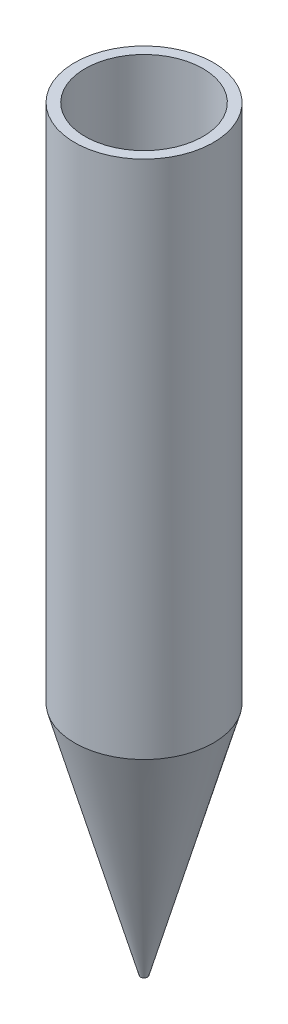
ISO-10303-21;
HEADER;
FILE_DESCRIPTION(('STEP AP214'),'2;1');
FILE_NAME('part.step','',(''),(''),'','','');
FILE_SCHEMA(('AUTOMOTIVE_DESIGN { 1 0 10303 214 1 1 1 1 }'));
ENDSEC;
DATA;
#1=APPLICATION_CONTEXT('core data for automotive mechanical design processes');
#2=APPLICATION_PROTOCOL_DEFINITION('international standard','automotive_design',2000,#1);
#3=PRODUCT_CONTEXT('',#1,'mechanical');
#4=PRODUCT('Part','Part','',(#3));
#5=PRODUCT_RELATED_PRODUCT_CATEGORY('part','',(#4));
#6=PRODUCT_DEFINITION_FORMATION('','',#4);
#7=PRODUCT_DEFINITION_CONTEXT('part definition',#1,'design');
#8=PRODUCT_DEFINITION('design','',#6,#7);
#9=PRODUCT_DEFINITION_SHAPE('','',#8);
#10=(LENGTH_UNIT() NAMED_UNIT(*) SI_UNIT(.MILLI.,.METRE.));
#11=(NAMED_UNIT(*) PLANE_ANGLE_UNIT() SI_UNIT($,.RADIAN.));
#12=(NAMED_UNIT(*) SI_UNIT($,.STERADIAN.) SOLID_ANGLE_UNIT());
#13=UNCERTAINTY_MEASURE_WITH_UNIT(LENGTH_MEASURE(1.E-05),#10,'distance_accuracy_value','');
#14=(GEOMETRIC_REPRESENTATION_CONTEXT(3) GLOBAL_UNCERTAINTY_ASSIGNED_CONTEXT((#13)) GLOBAL_UNIT_ASSIGNED_CONTEXT((#10,
#11,#12)) REPRESENTATION_CONTEXT('',''));
#15=CARTESIAN_POINT('',(0.,0.,0.));
#16=DIRECTION('',(0.,0.,1.));
#17=DIRECTION('',(1.,0.,0.));
#18=AXIS2_PLACEMENT_3D('',#15,#16,#17);
#19=CARTESIAN_POINT('',(0.,0.,0.));
#20=DIRECTION('',(0.,-1.,0.));
#21=DIRECTION('',(0.,0.,-1.));
#22=AXIS2_PLACEMENT_3D('',#19,#20,#21);
#23=PLANE('',#22);
#24=CARTESIAN_POINT('',(0.,0.,0.));
#25=DIRECTION('',(0.,-1.,0.));
#26=DIRECTION('',(0.,0.,-1.));
#27=AXIS2_PLACEMENT_3D('',#24,#25,#26);
#28=CIRCLE('',#27,1.);
#29=CARTESIAN_POINT('',(0.,0.,1.));
#30=VERTEX_POINT('',#29);
#31=EDGE_CURVE('E10',#30,#30,#28,.T.);
#32=ORIENTED_EDGE('',*,*,#31,.T.);
#33=EDGE_LOOP('',(#32));
#34=FACE_BOUND('',#33,.T.);
#35=ADVANCED_FACE('F39',(#34),#23,.T.);
#36=CARTESIAN_POINT('',(0.,0.,0.));
#37=DIRECTION('',(0.,1.,0.));
#38=DIRECTION('',(0.,0.,1.));
#39=AXIS2_PLACEMENT_3D('',#36,#37,#38);
#40=CONICAL_SURFACE('',#39,1.,0.272463149403792);
#41=CARTESIAN_POINT('',(0.,68.,0.));
#42=DIRECTION('',(0.,-1.,0.));
#43=DIRECTION('',(0.,0.,-1.));
#44=AXIS2_PLACEMENT_3D('',#41,#42,#43);
#45=CIRCLE('',#44,20.);
#46=CARTESIAN_POINT('',(0.,68.,20.));
#47=VERTEX_POINT('',#46);
#48=EDGE_CURVE('E45',#47,#47,#45,.T.);
#49=CARTESIAN_POINT('',(0.,68.,20.));
#50=CARTESIAN_POINT('',(0.,67.2916666666667,19.8020833333333));
#51=CARTESIAN_POINT('',(0.,66.5833333333333,19.6041666666667));
#52=CARTESIAN_POINT('',(0.,65.1666666666667,19.2083333333333));
#53=CARTESIAN_POINT('',(0.,64.4583333333333,19.0104166666667));
#54=CARTESIAN_POINT('',(0.,63.0416666666667,18.6145833333333));
#55=CARTESIAN_POINT('',(0.,62.3333333333333,18.4166666666667));
#56=CARTESIAN_POINT('',(0.,60.9166666666667,18.0208333333333));
#57=CARTESIAN_POINT('',(0.,60.2083333333333,17.8229166666667));
#58=CARTESIAN_POINT('',(0.,58.7916666666667,17.4270833333333));
#59=CARTESIAN_POINT('',(0.,58.0833333333333,17.2291666666667));
#60=CARTESIAN_POINT('',(0.,56.6666666666667,16.8333333333333));
#61=CARTESIAN_POINT('',(0.,55.9583333333333,16.6354166666667));
#62=CARTESIAN_POINT('',(0.,54.5416666666667,16.2395833333333));
#63=CARTESIAN_POINT('',(0.,53.8333333333333,16.0416666666667));
#64=CARTESIAN_POINT('',(0.,52.4166666666667,15.6458333333333));
#65=CARTESIAN_POINT('',(0.,51.7083333333333,15.4479166666667));
#66=CARTESIAN_POINT('',(0.,50.2916666666667,15.0520833333333));
#67=CARTESIAN_POINT('',(0.,49.5833333333333,14.8541666666667));
#68=CARTESIAN_POINT('',(0.,48.1666666666667,14.4583333333333));
#69=CARTESIAN_POINT('',(0.,47.4583333333333,14.2604166666667));
#70=CARTESIAN_POINT('',(0.,46.0416666666667,13.8645833333333));
#71=CARTESIAN_POINT('',(0.,45.3333333333333,13.6666666666667));
#72=CARTESIAN_POINT('',(0.,43.9166666666667,13.2708333333333));
#73=CARTESIAN_POINT('',(0.,43.2083333333333,13.0729166666667));
#74=CARTESIAN_POINT('',(0.,41.7916666666667,12.6770833333333));
#75=CARTESIAN_POINT('',(0.,41.0833333333333,12.4791666666667));
#76=CARTESIAN_POINT('',(0.,39.6666666666667,12.0833333333333));
#77=CARTESIAN_POINT('',(0.,38.9583333333333,11.8854166666667));
#78=CARTESIAN_POINT('',(0.,37.5416666666667,11.4895833333333));
#79=CARTESIAN_POINT('',(0.,36.8333333333333,11.2916666666667));
#80=CARTESIAN_POINT('',(0.,35.4166666666667,10.8958333333333));
#81=CARTESIAN_POINT('',(0.,34.7083333333333,10.6979166666667));
#82=CARTESIAN_POINT('',(0.,33.2916666666667,10.3020833333333));
#83=CARTESIAN_POINT('',(0.,32.5833333333333,10.1041666666667));
#84=CARTESIAN_POINT('',(0.,31.1666666666667,9.70833333333333));
#85=CARTESIAN_POINT('',(0.,30.4583333333333,9.51041666666667));
#86=CARTESIAN_POINT('',(0.,29.0416666666667,9.11458333333333));
#87=CARTESIAN_POINT('',(0.,28.3333333333333,8.91666666666667));
#88=CARTESIAN_POINT('',(0.,26.9166666666667,8.52083333333334));
#89=CARTESIAN_POINT('',(0.,26.2083333333333,8.32291666666667));
#90=CARTESIAN_POINT('',(0.,24.7916666666667,7.92708333333333));
#91=CARTESIAN_POINT('',(0.,24.0833333333333,7.72916666666667));
#92=CARTESIAN_POINT('',(0.,22.6666666666667,7.33333333333333));
#93=CARTESIAN_POINT('',(0.,21.9583333333333,7.13541666666667));
#94=CARTESIAN_POINT('',(0.,20.5416666666667,6.73958333333333));
#95=CARTESIAN_POINT('',(0.,19.8333333333333,6.54166666666667));
#96=CARTESIAN_POINT('',(0.,18.4166666666667,6.14583333333333));
#97=CARTESIAN_POINT('',(0.,17.7083333333333,5.94791666666667));
#98=CARTESIAN_POINT('',(0.,16.2916666666667,5.55208333333333));
#99=CARTESIAN_POINT('',(0.,15.5833333333333,5.35416666666667));
#100=CARTESIAN_POINT('',(0.,14.1666666666667,4.95833333333333));
#101=CARTESIAN_POINT('',(0.,13.4583333333333,4.76041666666667));
#102=CARTESIAN_POINT('',(0.,12.0416666666667,4.36458333333333));
#103=CARTESIAN_POINT('',(0.,11.3333333333333,4.16666666666667));
#104=CARTESIAN_POINT('',(0.,9.91666666666667,3.77083333333333));
#105=CARTESIAN_POINT('',(0.,9.20833333333333,3.57291666666667));
#106=CARTESIAN_POINT('',(0.,7.79166666666667,3.17708333333333));
#107=CARTESIAN_POINT('',(0.,7.08333333333333,2.97916666666667));
#108=CARTESIAN_POINT('',(0.,5.66666666666667,2.58333333333333));
#109=CARTESIAN_POINT('',(0.,4.95833333333334,2.38541666666667));
#110=CARTESIAN_POINT('',(0.,3.54166666666667,1.98958333333333));
#111=CARTESIAN_POINT('',(0.,2.83333333333334,1.79166666666667));
#112=CARTESIAN_POINT('',(0.,1.41666666666667,1.39583333333333));
#113=CARTESIAN_POINT('',(0.,0.708333333333335,1.19791666666667));
#114=CARTESIAN_POINT('',(0.,0.,1.));
#115=B_SPLINE_CURVE_WITH_KNOTS('',3,(#49,#50,#51,#52,#53,#54,#55,#56,#57,#58,#59,#60,#61,#62,
#63,#64,#65,#66,#67,#68,#69,#70,#71,#72,#73,#74,#75,#76,#77,#78,#79,#80,#81,#82,#83,#84,#85,#86,
#87,#88,#89,#90,#91,#92,#93,#94,#95,#96,#97,#98,#99,#100,#101,#102,#103,#104,#105,#106,#107,
#108,#109,#110,#111,#112,#113,#114),.UNSPECIFIED.,.F.,.F.,(4,2,2,2,2,2,2,2,2,2,2,2,2,2,2,2,2,2,
2,2,2,2,2,2,2,2,2,2,2,2,2,2,4),(0.,2.20639163851298,4.41278327702597,6.61917491553894,
8.82556655405193,11.0319581925649,13.2383498310779,15.4447414695909,17.6511331081039,
19.8575247466168,22.0639163851298,24.2703080236428,26.4766996621558,28.6830913006688,
30.8894829391817,33.0958745776947,35.3022662162077,37.5086578547207,39.7150494932337,
41.9214411317466,44.1278327702596,46.3342244087726,48.5406160472856,50.7470076857986,
52.9533993243115,55.1597909628245,57.3661826013375,59.5725742398505,61.7789658783635,
63.9853575168764,66.1917491553894,68.3981407939024,70.6045324324154),.UNSPECIFIED.);
#116=EDGE_CURVE('BSEAM74',#47,#30,#115,.T.);
#117=ORIENTED_EDGE('',*,*,#48,.T.);
#118=ORIENTED_EDGE('',*,*,#31,.F.);
#119=ORIENTED_EDGE('',*,*,#116,.T.);
#120=ORIENTED_EDGE('',*,*,#116,.F.);
#121=EDGE_LOOP('',(#117,#119,#118,#120));
#122=FACE_BOUND('',#121,.T.);
#123=ADVANCED_FACE('F74',(#122),#40,.T.);
#124=CARTESIAN_POINT('',(0.,0.,0.));
#125=DIRECTION('',(0.,-1.,0.));
#126=DIRECTION('',(0.,0.,-1.));
#127=AXIS2_PLACEMENT_3D('',#124,#125,#126);
#128=CYLINDRICAL_SURFACE('',#127,20.);
#129=CARTESIAN_POINT('',(0.,218.,0.));
#130=DIRECTION('',(0.,-1.,0.));
#131=DIRECTION('',(0.,0.,-1.));
#132=AXIS2_PLACEMENT_3D('',#129,#130,#131);
#133=CIRCLE('',#132,20.);
#134=CARTESIAN_POINT('',(0.,218.,-20.));
#135=VERTEX_POINT('',#134);
#136=EDGE_CURVE('E49',#135,#135,#133,.T.);
#137=ORIENTED_EDGE('',*,*,#136,.T.);
#138=EDGE_LOOP('',(#137));
#139=FACE_BOUND('',#138,.T.);
#140=ORIENTED_EDGE('',*,*,#48,.F.);
#141=EDGE_LOOP('',(#140));
#142=FACE_BOUND('',#141,.T.);
#143=ADVANCED_FACE('F78',(#139,#142),#128,.T.);
#144=CARTESIAN_POINT('',(17.,218.,0.));
#145=DIRECTION('',(0.,1.,0.));
#146=DIRECTION('',(0.,0.,1.));
#147=AXIS2_PLACEMENT_3D('',#144,#145,#146);
#148=PLANE('',#147);
#149=CARTESIAN_POINT('',(0.,218.,0.));
#150=DIRECTION('',(0.,-1.,0.));
#151=DIRECTION('',(0.,0.,-1.));
#152=AXIS2_PLACEMENT_3D('',#149,#150,#151);
#153=CIRCLE('',#152,17.);
#154=CARTESIAN_POINT('',(0.,218.,-17.));
#155=VERTEX_POINT('',#154);
#156=EDGE_CURVE('E53',#155,#155,#153,.T.);
#157=ORIENTED_EDGE('',*,*,#156,.T.);
#158=EDGE_LOOP('',(#157));
#159=FACE_BOUND('',#158,.T.);
#160=ORIENTED_EDGE('',*,*,#136,.F.);
#161=EDGE_LOOP('',(#160));
#162=FACE_BOUND('',#161,.T.);
#163=ADVANCED_FACE('F71',(#159,#162),#148,.T.);
#164=CARTESIAN_POINT('',(0.,0.,0.));
#165=DIRECTION('',(0.,-1.,0.));
#166=DIRECTION('',(0.,0.,-1.));
#167=AXIS2_PLACEMENT_3D('',#164,#165,#166);
#168=CYLINDRICAL_SURFACE('',#167,17.);
#169=CARTESIAN_POINT('',(0.,68.,0.));
#170=DIRECTION('',(0.,-1.,0.));
#171=DIRECTION('',(0.,0.,-1.));
#172=AXIS2_PLACEMENT_3D('',#169,#170,#171);
#173=CIRCLE('',#172,17.);
#174=CARTESIAN_POINT('',(0.,68.,-17.));
#175=VERTEX_POINT('',#174);
#176=EDGE_CURVE('E58',#175,#175,#173,.T.);
#177=ORIENTED_EDGE('',*,*,#176,.T.);
#178=EDGE_LOOP('',(#177));
#179=FACE_BOUND('',#178,.T.);
#180=ORIENTED_EDGE('',*,*,#156,.F.);
#181=EDGE_LOOP('',(#180));
#182=FACE_BOUND('',#181,.T.);
#183=ADVANCED_FACE('F62',(#179,#182),#168,.F.);
#184=CARTESIAN_POINT('',(17.,68.,0.));
#185=DIRECTION('',(0.,1.,0.));
#186=DIRECTION('',(0.,0.,1.));
#187=AXIS2_PLACEMENT_3D('',#184,#185,#186);
#188=PLANE('',#187);
#189=ORIENTED_EDGE('',*,*,#176,.F.);
#190=EDGE_LOOP('',(#189));
#191=FACE_BOUND('',#190,.T.);
#192=ADVANCED_FACE('F65',(#191),#188,.T.);
#193=CLOSED_SHELL('',(#35,#123,#143,#163,#183,#192));
#194=MANIFOLD_SOLID_BREP('B2',#193);
#195=ADVANCED_BREP_SHAPE_REPRESENTATION('',(#18,#194),#14);
#196=SHAPE_DEFINITION_REPRESENTATION(#9,#195);
ENDSEC;
END-ISO-10303-21;
